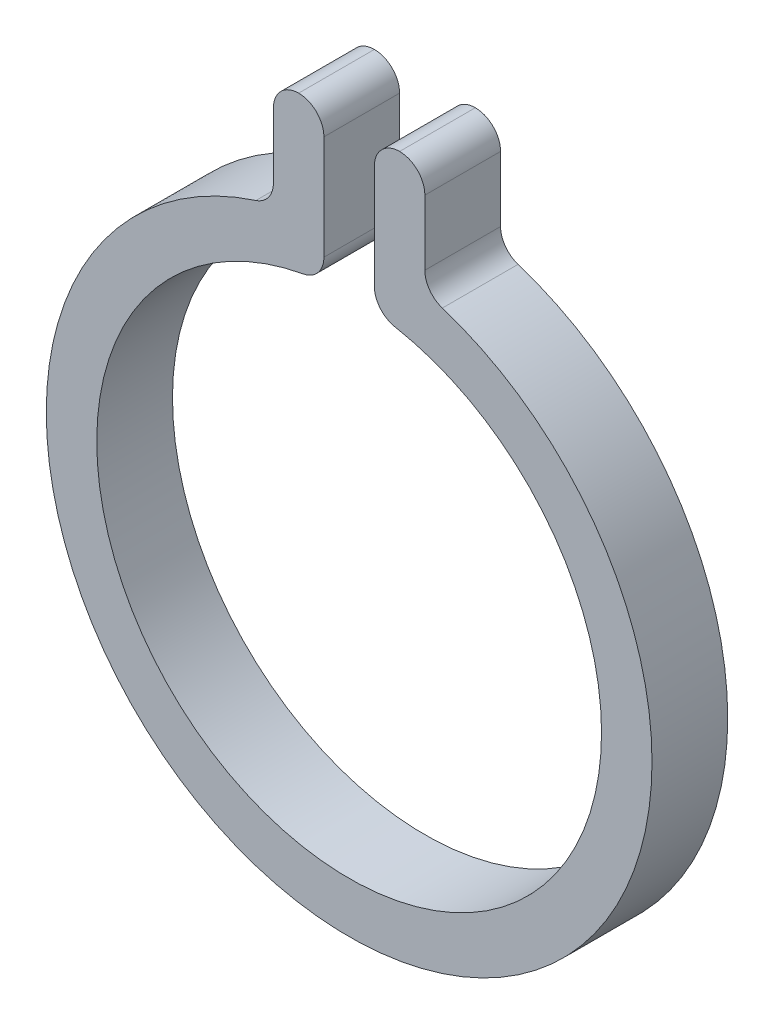
ISO-10303-21;
HEADER;
FILE_DESCRIPTION(('STEP AP214'),'2;1');
FILE_NAME('part.step','',(''),(''),'','','');
FILE_SCHEMA(('AUTOMOTIVE_DESIGN { 1 0 10303 214 1 1 1 1 }'));
ENDSEC;
DATA;
#1=APPLICATION_CONTEXT('core data for automotive mechanical design processes');
#2=APPLICATION_PROTOCOL_DEFINITION('international standard','automotive_design',2000,#1);
#3=PRODUCT_CONTEXT('',#1,'mechanical');
#4=PRODUCT('Part','Part','',(#3));
#5=PRODUCT_RELATED_PRODUCT_CATEGORY('part','',(#4));
#6=PRODUCT_DEFINITION_FORMATION('','',#4);
#7=PRODUCT_DEFINITION_CONTEXT('part definition',#1,'design');
#8=PRODUCT_DEFINITION('design','',#6,#7);
#9=PRODUCT_DEFINITION_SHAPE('','',#8);
#10=(LENGTH_UNIT() NAMED_UNIT(*) SI_UNIT(.MILLI.,.METRE.));
#11=(NAMED_UNIT(*) PLANE_ANGLE_UNIT() SI_UNIT($,.RADIAN.));
#12=(NAMED_UNIT(*) SI_UNIT($,.STERADIAN.) SOLID_ANGLE_UNIT());
#13=UNCERTAINTY_MEASURE_WITH_UNIT(LENGTH_MEASURE(1.E-05),#10,'distance_accuracy_value','');
#14=(GEOMETRIC_REPRESENTATION_CONTEXT(3) GLOBAL_UNCERTAINTY_ASSIGNED_CONTEXT((#13)) GLOBAL_UNIT_ASSIGNED_CONTEXT((#10,
#11,#12)) REPRESENTATION_CONTEXT('',''));
#15=CARTESIAN_POINT('',(0.,0.,0.));
#16=DIRECTION('',(0.,0.,1.));
#17=DIRECTION('',(1.,0.,0.));
#18=AXIS2_PLACEMENT_3D('',#15,#16,#17);
#19=CARTESIAN_POINT('',(-6.,0.,6.));
#20=DIRECTION('',(-1.,0.,0.));
#21=DIRECTION('',(0.,-1.,0.));
#22=AXIS2_PLACEMENT_3D('',#19,#20,#21);
#23=PLANE('',#22);
#24=DIRECTION('',(0.,1.,0.));
#25=VECTOR('',#24,1.);
#26=CARTESIAN_POINT('',(-6.,0.,6.));
#27=LINE('',#26,#25);
#28=CARTESIAN_POINT('',(-6.,24.738633753706,6.));
#29=VERTEX_POINT('',#28);
#30=CARTESIAN_POINT('',(-6.,29.8918735928238,6.));
#31=VERTEX_POINT('',#30);
#32=EDGE_CURVE('E212',#29,#31,#27,.T.);
#33=ORIENTED_EDGE('',*,*,#32,.T.);
#34=DIRECTION('',(0.,0.,-1.));
#35=VECTOR('',#34,1.);
#36=CARTESIAN_POINT('',(-6.,29.8918735928238,6.));
#37=LINE('',#36,#35);
#38=CARTESIAN_POINT('',(-6.,29.8918735928238,0.));
#39=VERTEX_POINT('',#38);
#40=EDGE_CURVE('E158',#31,#39,#37,.T.);
#41=ORIENTED_EDGE('',*,*,#40,.T.);
#42=DIRECTION('',(0.,1.,0.));
#43=VECTOR('',#42,1.);
#44=CARTESIAN_POINT('',(-6.,0.,0.));
#45=LINE('',#44,#43);
#46=CARTESIAN_POINT('',(-6.,24.738633753706,0.));
#47=VERTEX_POINT('',#46);
#48=EDGE_CURVE('E143',#47,#39,#45,.T.);
#49=ORIENTED_EDGE('',*,*,#48,.F.);
#50=DIRECTION('',(0.,0.,-1.));
#51=VECTOR('',#50,1.);
#52=CARTESIAN_POINT('',(-6.,24.738633753706,6.));
#53=LINE('',#52,#51);
#54=EDGE_CURVE('E155',#47,#29,#53,.F.);
#55=ORIENTED_EDGE('',*,*,#54,.T.);
#56=EDGE_LOOP('',(#33,#41,#49,#55));
#57=FACE_BOUND('',#56,.T.);
#58=ADVANCED_FACE('F38',(#57),#23,.T.);
#59=CARTESIAN_POINT('',(0.,0.,6.));
#60=DIRECTION('',(0.,0.,-1.));
#61=DIRECTION('',(-1.,0.,0.));
#62=AXIS2_PLACEMENT_3D('',#59,#60,#61);
#63=CYLINDRICAL_SURFACE('',#62,24.);
#64=CARTESIAN_POINT('',(0.,0.,0.));
#65=DIRECTION('',(0.,0.,1.));
#66=DIRECTION('',(1.,0.,0.));
#67=AXIS2_PLACEMENT_3D('',#64,#65,#66);
#68=CIRCLE('',#67,24.);
#69=CARTESIAN_POINT('',(-7.38461538461539,22.8356619264978,0.));
#70=VERTEX_POINT('',#69);
#71=CARTESIAN_POINT('',(7.38461538461538,22.8356619264978,0.));
#72=VERTEX_POINT('',#71);
#73=EDGE_CURVE('E146',#70,#72,#68,.T.);
#74=ORIENTED_EDGE('',*,*,#73,.T.);
#75=DIRECTION('',(0.,0.,-1.));
#76=VECTOR('',#75,1.);
#77=CARTESIAN_POINT('',(7.38461538461538,22.8356619264978,6.));
#78=LINE('',#77,#76);
#79=CARTESIAN_POINT('',(7.38461538461538,22.8356619264978,6.));
#80=VERTEX_POINT('',#79);
#81=EDGE_CURVE('E176',#72,#80,#78,.F.);
#82=ORIENTED_EDGE('',*,*,#81,.T.);
#83=CARTESIAN_POINT('',(0.,0.,6.));
#84=DIRECTION('',(0.,0.,1.));
#85=DIRECTION('',(1.,0.,0.));
#86=AXIS2_PLACEMENT_3D('',#83,#84,#85);
#87=CIRCLE('',#86,24.);
#88=CARTESIAN_POINT('',(-7.38461538461539,22.8356619264978,6.));
#89=VERTEX_POINT('',#88);
#90=EDGE_CURVE('E214',#89,#80,#87,.T.);
#91=ORIENTED_EDGE('',*,*,#90,.F.);
#92=DIRECTION('',(0.,0.,-1.));
#93=VECTOR('',#92,1.);
#94=CARTESIAN_POINT('',(-7.38461538461539,22.8356619264978,6.));
#95=LINE('',#94,#93);
#96=EDGE_CURVE('E174',#89,#70,#95,.T.);
#97=ORIENTED_EDGE('',*,*,#96,.T.);
#98=EDGE_LOOP('',(#74,#82,#91,#97));
#99=FACE_BOUND('',#98,.T.);
#100=ADVANCED_FACE('F311',(#99),#63,.T.);
#101=CARTESIAN_POINT('',(6.,0.,6.));
#102=DIRECTION('',(-1.,0.,0.));
#103=DIRECTION('',(0.,0.,1.));
#104=AXIS2_PLACEMENT_3D('',#101,#102,#103);
#105=PLANE('',#104);
#106=DIRECTION('',(0.,1.,0.));
#107=VECTOR('',#106,1.);
#108=CARTESIAN_POINT('',(6.,0.,0.));
#109=LINE('',#108,#107);
#110=CARTESIAN_POINT('',(6.,24.738633753706,0.));
#111=VERTEX_POINT('',#110);
#112=CARTESIAN_POINT('',(6.,29.8918735928238,0.));
#113=VERTEX_POINT('',#112);
#114=EDGE_CURVE('E288',#111,#113,#109,.T.);
#115=ORIENTED_EDGE('',*,*,#114,.T.);
#116=DIRECTION('',(0.,0.,-1.));
#117=VECTOR('',#116,1.);
#118=CARTESIAN_POINT('',(6.,29.8918735928238,6.));
#119=LINE('',#118,#117);
#120=CARTESIAN_POINT('',(6.,29.8918735928238,6.));
#121=VERTEX_POINT('',#120);
#122=EDGE_CURVE('E272',#113,#121,#119,.F.);
#123=ORIENTED_EDGE('',*,*,#122,.T.);
#124=DIRECTION('',(0.,1.,0.));
#125=VECTOR('',#124,1.);
#126=CARTESIAN_POINT('',(6.,0.,6.));
#127=LINE('',#126,#125);
#128=CARTESIAN_POINT('',(6.,24.738633753706,6.));
#129=VERTEX_POINT('',#128);
#130=EDGE_CURVE('E220',#129,#121,#127,.T.);
#131=ORIENTED_EDGE('',*,*,#130,.F.);
#132=DIRECTION('',(0.,0.,1.));
#133=VECTOR('',#132,1.);
#134=CARTESIAN_POINT('',(6.,24.738633753706,0.));
#135=LINE('',#134,#133);
#136=EDGE_CURVE('E269',#129,#111,#135,.F.);
#137=ORIENTED_EDGE('',*,*,#136,.T.);
#138=EDGE_LOOP('',(#115,#123,#131,#137));
#139=FACE_BOUND('',#138,.T.);
#140=ADVANCED_FACE('F303',(#139),#105,.F.);
#141=CARTESIAN_POINT('',(2.,0.,6.));
#142=DIRECTION('',(-1.,0.,0.));
#143=DIRECTION('',(0.,0.,1.));
#144=AXIS2_PLACEMENT_3D('',#141,#142,#143);
#145=PLANE('',#144);
#146=DIRECTION('',(0.,1.,0.));
#147=VECTOR('',#146,1.);
#148=CARTESIAN_POINT('',(2.,0.,6.));
#149=LINE('',#148,#147);
#150=CARTESIAN_POINT('',(2.,21.6333076527839,6.));
#151=VERTEX_POINT('',#150);
#152=CARTESIAN_POINT('',(2.,29.8918735928238,6.));
#153=VERTEX_POINT('',#152);
#154=EDGE_CURVE('E225',#151,#153,#149,.T.);
#155=ORIENTED_EDGE('',*,*,#154,.T.);
#156=DIRECTION('',(0.,0.,-1.));
#157=VECTOR('',#156,1.);
#158=CARTESIAN_POINT('',(2.,29.8918735928238,6.));
#159=LINE('',#158,#157);
#160=CARTESIAN_POINT('',(2.,29.8918735928238,0.));
#161=VERTEX_POINT('',#160);
#162=EDGE_CURVE('E240',#153,#161,#159,.T.);
#163=ORIENTED_EDGE('',*,*,#162,.T.);
#164=DIRECTION('',(0.,1.,0.));
#165=VECTOR('',#164,1.);
#166=CARTESIAN_POINT('',(2.,0.,0.));
#167=LINE('',#166,#165);
#168=CARTESIAN_POINT('',(2.,21.6333076527839,0.));
#169=VERTEX_POINT('',#168);
#170=EDGE_CURVE('E256',#169,#161,#167,.T.);
#171=ORIENTED_EDGE('',*,*,#170,.F.);
#172=DIRECTION('',(0.,0.,-1.));
#173=VECTOR('',#172,1.);
#174=CARTESIAN_POINT('',(2.,21.6333076527839,6.));
#175=LINE('',#174,#173);
#176=EDGE_CURVE('E237',#169,#151,#175,.F.);
#177=ORIENTED_EDGE('',*,*,#176,.T.);
#178=EDGE_LOOP('',(#155,#163,#171,#177));
#179=FACE_BOUND('',#178,.T.);
#180=ADVANCED_FACE('F318',(#179),#145,.T.);
#181=CARTESIAN_POINT('',(0.,0.,6.));
#182=DIRECTION('',(0.,0.,-1.));
#183=DIRECTION('',(-1.,0.,0.));
#184=AXIS2_PLACEMENT_3D('',#181,#182,#183);
#185=CYLINDRICAL_SURFACE('',#184,20.);
#186=CARTESIAN_POINT('',(0.,0.,0.));
#187=DIRECTION('',(0.,0.,1.));
#188=DIRECTION('',(1.,0.,0.));
#189=AXIS2_PLACEMENT_3D('',#186,#187,#188);
#190=CIRCLE('',#189,20.);
#191=CARTESIAN_POINT('',(-3.63636363636364,19.6666433207127,0.));
#192=VERTEX_POINT('',#191);
#193=CARTESIAN_POINT('',(3.63636363636364,19.6666433207127,0.));
#194=VERTEX_POINT('',#193);
#195=EDGE_CURVE('E254',#192,#194,#190,.T.);
#196=ORIENTED_EDGE('',*,*,#195,.F.);
#197=DIRECTION('',(0.,0.,-1.));
#198=VECTOR('',#197,1.);
#199=CARTESIAN_POINT('',(-3.63636363636364,19.6666433207127,6.));
#200=LINE('',#199,#198);
#201=CARTESIAN_POINT('',(-3.63636363636364,19.6666433207127,6.));
#202=VERTEX_POINT('',#201);
#203=EDGE_CURVE('E172',#192,#202,#200,.F.);
#204=ORIENTED_EDGE('',*,*,#203,.T.);
#205=CARTESIAN_POINT('',(0.,0.,6.));
#206=DIRECTION('',(0.,0.,1.));
#207=DIRECTION('',(1.,0.,0.));
#208=AXIS2_PLACEMENT_3D('',#205,#206,#207);
#209=CIRCLE('',#208,20.);
#210=CARTESIAN_POINT('',(3.63636363636364,19.6666433207127,6.));
#211=VERTEX_POINT('',#210);
#212=EDGE_CURVE('E279',#202,#211,#209,.T.);
#213=ORIENTED_EDGE('',*,*,#212,.T.);
#214=DIRECTION('',(0.,0.,-1.));
#215=VECTOR('',#214,1.);
#216=CARTESIAN_POINT('',(3.63636363636364,19.6666433207127,6.));
#217=LINE('',#216,#215);
#218=EDGE_CURVE('E164',#211,#194,#217,.T.);
#219=ORIENTED_EDGE('',*,*,#218,.T.);
#220=EDGE_LOOP('',(#196,#204,#213,#219));
#221=FACE_BOUND('',#220,.T.);
#222=ADVANCED_FACE('F325',(#221),#185,.F.);
#223=CARTESIAN_POINT('',(-2.,0.,6.));
#224=DIRECTION('',(-1.,0.,0.));
#225=DIRECTION('',(0.,0.,1.));
#226=AXIS2_PLACEMENT_3D('',#223,#224,#225);
#227=PLANE('',#226);
#228=DIRECTION('',(0.,1.,0.));
#229=VECTOR('',#228,1.);
#230=CARTESIAN_POINT('',(-2.,0.,0.));
#231=LINE('',#230,#229);
#232=CARTESIAN_POINT('',(-2.,21.6333076527839,0.));
#233=VERTEX_POINT('',#232);
#234=CARTESIAN_POINT('',(-2.,29.8918735928238,0.));
#235=VERTEX_POINT('',#234);
#236=EDGE_CURVE('E215',#233,#235,#231,.T.);
#237=ORIENTED_EDGE('',*,*,#236,.T.);
#238=DIRECTION('',(0.,0.,-1.));
#239=VECTOR('',#238,1.);
#240=CARTESIAN_POINT('',(-2.,29.8918735928238,6.));
#241=LINE('',#240,#239);
#242=CARTESIAN_POINT('',(-2.,29.8918735928238,6.));
#243=VERTEX_POINT('',#242);
#244=EDGE_CURVE('E162',#235,#243,#241,.F.);
#245=ORIENTED_EDGE('',*,*,#244,.T.);
#246=DIRECTION('',(0.,1.,0.));
#247=VECTOR('',#246,1.);
#248=CARTESIAN_POINT('',(-2.,0.,6.));
#249=LINE('',#248,#247);
#250=CARTESIAN_POINT('',(-2.,21.6333076527839,6.));
#251=VERTEX_POINT('',#250);
#252=EDGE_CURVE('E248',#251,#243,#249,.T.);
#253=ORIENTED_EDGE('',*,*,#252,.F.);
#254=DIRECTION('',(0.,0.,1.));
#255=VECTOR('',#254,1.);
#256=CARTESIAN_POINT('',(-2.,21.6333076527839,0.));
#257=LINE('',#256,#255);
#258=EDGE_CURVE('E166',#251,#233,#257,.F.);
#259=ORIENTED_EDGE('',*,*,#258,.T.);
#260=EDGE_LOOP('',(#237,#245,#253,#259));
#261=FACE_BOUND('',#260,.T.);
#262=ADVANCED_FACE('F247',(#261),#227,.F.);
#263=CARTESIAN_POINT('',(0.,0.,6.));
#264=DIRECTION('',(0.,0.,1.));
#265=DIRECTION('',(1.,0.,0.));
#266=AXIS2_PLACEMENT_3D('',#263,#264,#265);
#267=PLANE('',#266);
#268=ORIENTED_EDGE('',*,*,#130,.T.);
#269=CARTESIAN_POINT('',(4.,29.8918735928238,6.));
#270=DIRECTION('',(0.,0.,1.));
#271=DIRECTION('',(1.,0.,0.));
#272=AXIS2_PLACEMENT_3D('',#269,#270,#271);
#273=CIRCLE('',#272,2.);
#274=CARTESIAN_POINT('',(4.,31.8918735928238,6.));
#275=VERTEX_POINT('',#274);
#276=EDGE_CURVE('E233',#121,#275,#273,.T.);
#277=ORIENTED_EDGE('',*,*,#276,.T.);
#278=CARTESIAN_POINT('',(4.,29.8918735928238,6.));
#279=DIRECTION('',(0.,0.,1.));
#280=DIRECTION('',(1.,0.,0.));
#281=AXIS2_PLACEMENT_3D('',#278,#279,#280);
#282=CIRCLE('',#281,2.);
#283=EDGE_CURVE('E198',#275,#153,#282,.T.);
#284=ORIENTED_EDGE('',*,*,#283,.T.);
#285=ORIENTED_EDGE('',*,*,#154,.F.);
#286=CARTESIAN_POINT('',(4.,21.6333076527839,6.));
#287=DIRECTION('',(0.,0.,1.));
#288=DIRECTION('',(1.,0.,0.));
#289=AXIS2_PLACEMENT_3D('',#286,#287,#288);
#290=CIRCLE('',#289,2.);
#291=EDGE_CURVE('E201',#151,#211,#290,.T.);
#292=ORIENTED_EDGE('',*,*,#291,.T.);
#293=ORIENTED_EDGE('',*,*,#212,.F.);
#294=CARTESIAN_POINT('',(-4.,21.6333076527839,6.));
#295=DIRECTION('',(0.,0.,1.));
#296=DIRECTION('',(1.,0.,0.));
#297=AXIS2_PLACEMENT_3D('',#294,#295,#296);
#298=CIRCLE('',#297,2.);
#299=EDGE_CURVE('E194',#202,#251,#298,.T.);
#300=ORIENTED_EDGE('',*,*,#299,.T.);
#301=ORIENTED_EDGE('',*,*,#252,.T.);
#302=CARTESIAN_POINT('',(-4.,29.8918735928238,6.));
#303=DIRECTION('',(0.,0.,1.));
#304=DIRECTION('',(1.,0.,0.));
#305=AXIS2_PLACEMENT_3D('',#302,#303,#304);
#306=CIRCLE('',#305,2.);
#307=CARTESIAN_POINT('',(-4.,31.8918735928238,6.));
#308=VERTEX_POINT('',#307);
#309=EDGE_CURVE('E56',#243,#308,#306,.T.);
#310=ORIENTED_EDGE('',*,*,#309,.T.);
#311=CARTESIAN_POINT('',(-4.,29.8918735928238,6.));
#312=DIRECTION('',(0.,0.,1.));
#313=DIRECTION('',(1.,0.,0.));
#314=AXIS2_PLACEMENT_3D('',#311,#312,#313);
#315=CIRCLE('',#314,2.);
#316=EDGE_CURVE('E192',#308,#31,#315,.T.);
#317=ORIENTED_EDGE('',*,*,#316,.T.);
#318=ORIENTED_EDGE('',*,*,#32,.F.);
#319=CARTESIAN_POINT('',(-8.,24.738633753706,6.));
#320=DIRECTION('',(0.,0.,1.));
#321=DIRECTION('',(1.,0.,0.));
#322=AXIS2_PLACEMENT_3D('',#319,#320,#321);
#323=CIRCLE('',#322,2.);
#324=EDGE_CURVE('E12',#29,#89,#323,.F.);
#325=ORIENTED_EDGE('',*,*,#324,.T.);
#326=ORIENTED_EDGE('',*,*,#90,.T.);
#327=CARTESIAN_POINT('',(8.,24.738633753706,6.));
#328=DIRECTION('',(0.,0.,1.));
#329=DIRECTION('',(1.,0.,0.));
#330=AXIS2_PLACEMENT_3D('',#327,#328,#329);
#331=CIRCLE('',#330,2.);
#332=EDGE_CURVE('E151',#80,#129,#331,.F.);
#333=ORIENTED_EDGE('',*,*,#332,.T.);
#334=EDGE_LOOP('',(#268,#277,#284,#285,#292,#293,#300,#301,#310,#317,#318,#325,#326,#333));
#335=FACE_BOUND('',#334,.T.);
#336=ADVANCED_FACE('F313',(#335),#267,.T.);
#337=CARTESIAN_POINT('',(0.,0.,0.));
#338=DIRECTION('',(0.,0.,1.));
#339=DIRECTION('',(1.,0.,0.));
#340=AXIS2_PLACEMENT_3D('',#337,#338,#339);
#341=PLANE('',#340);
#342=CARTESIAN_POINT('',(4.,29.8918735928238,0.));
#343=DIRECTION('',(0.,0.,1.));
#344=DIRECTION('',(1.,0.,0.));
#345=AXIS2_PLACEMENT_3D('',#342,#343,#344);
#346=CIRCLE('',#345,2.);
#347=CARTESIAN_POINT('',(4.,31.8918735928238,0.));
#348=VERTEX_POINT('',#347);
#349=EDGE_CURVE('E265',#161,#348,#346,.F.);
#350=ORIENTED_EDGE('',*,*,#349,.T.);
#351=CARTESIAN_POINT('',(4.,29.8918735928238,0.));
#352=DIRECTION('',(0.,0.,1.));
#353=DIRECTION('',(1.,0.,0.));
#354=AXIS2_PLACEMENT_3D('',#351,#352,#353);
#355=CIRCLE('',#354,2.);
#356=EDGE_CURVE('E267',#348,#113,#355,.F.);
#357=ORIENTED_EDGE('',*,*,#356,.T.);
#358=ORIENTED_EDGE('',*,*,#114,.F.);
#359=CARTESIAN_POINT('',(8.,24.738633753706,0.));
#360=DIRECTION('',(0.,0.,1.));
#361=DIRECTION('',(1.,0.,0.));
#362=AXIS2_PLACEMENT_3D('',#359,#360,#361);
#363=CIRCLE('',#362,2.);
#364=EDGE_CURVE('E178',#111,#72,#363,.T.);
#365=ORIENTED_EDGE('',*,*,#364,.T.);
#366=ORIENTED_EDGE('',*,*,#73,.F.);
#367=CARTESIAN_POINT('',(-8.,24.738633753706,0.));
#368=DIRECTION('',(0.,0.,1.));
#369=DIRECTION('',(1.,0.,0.));
#370=AXIS2_PLACEMENT_3D('',#367,#368,#369);
#371=CIRCLE('',#370,2.);
#372=EDGE_CURVE('E48',#70,#47,#371,.T.);
#373=ORIENTED_EDGE('',*,*,#372,.T.);
#374=ORIENTED_EDGE('',*,*,#48,.T.);
#375=CARTESIAN_POINT('',(-4.,29.8918735928238,0.));
#376=DIRECTION('',(0.,0.,1.));
#377=DIRECTION('',(1.,0.,0.));
#378=AXIS2_PLACEMENT_3D('',#375,#376,#377);
#379=CIRCLE('',#378,2.);
#380=CARTESIAN_POINT('',(-4.,31.8918735928238,0.));
#381=VERTEX_POINT('',#380);
#382=EDGE_CURVE('E191',#39,#381,#379,.F.);
#383=ORIENTED_EDGE('',*,*,#382,.T.);
#384=CARTESIAN_POINT('',(-4.,29.8918735928238,0.));
#385=DIRECTION('',(0.,0.,1.));
#386=DIRECTION('',(1.,0.,0.));
#387=AXIS2_PLACEMENT_3D('',#384,#385,#386);
#388=CIRCLE('',#387,2.);
#389=EDGE_CURVE('E188',#381,#235,#388,.F.);
#390=ORIENTED_EDGE('',*,*,#389,.T.);
#391=ORIENTED_EDGE('',*,*,#236,.F.);
#392=CARTESIAN_POINT('',(-4.,21.6333076527839,0.));
#393=DIRECTION('',(0.,0.,1.));
#394=DIRECTION('',(1.,0.,0.));
#395=AXIS2_PLACEMENT_3D('',#392,#393,#394);
#396=CIRCLE('',#395,2.);
#397=EDGE_CURVE('E252',#233,#192,#396,.F.);
#398=ORIENTED_EDGE('',*,*,#397,.T.);
#399=ORIENTED_EDGE('',*,*,#195,.T.);
#400=CARTESIAN_POINT('',(4.,21.6333076527839,0.));
#401=DIRECTION('',(0.,0.,1.));
#402=DIRECTION('',(1.,0.,0.));
#403=AXIS2_PLACEMENT_3D('',#400,#401,#402);
#404=CIRCLE('',#403,2.);
#405=EDGE_CURVE('E260',#194,#169,#404,.F.);
#406=ORIENTED_EDGE('',*,*,#405,.T.);
#407=ORIENTED_EDGE('',*,*,#170,.T.);
#408=EDGE_LOOP('',(#350,#357,#358,#365,#366,#373,#374,#383,#390,#391,#398,#399,#406,#407));
#409=FACE_BOUND('',#408,.T.);
#410=ADVANCED_FACE('F142',(#409),#341,.F.);
#411=CARTESIAN_POINT('',(4.,29.8918735928238,6.));
#412=DIRECTION('',(0.,0.,-1.));
#413=DIRECTION('',(-1.,0.,0.));
#414=AXIS2_PLACEMENT_3D('',#411,#412,#413);
#415=CYLINDRICAL_SURFACE('',#414,2.);
#416=ORIENTED_EDGE('',*,*,#162,.F.);
#417=ORIENTED_EDGE('',*,*,#283,.F.);
#418=DIRECTION('',(0.,0.,-1.));
#419=VECTOR('',#418,1.);
#420=CARTESIAN_POINT('',(4.,31.8918735928238,6.));
#421=LINE('',#420,#419);
#422=EDGE_CURVE('E159',#348,#275,#421,.F.);
#423=ORIENTED_EDGE('',*,*,#422,.F.);
#424=ORIENTED_EDGE('',*,*,#349,.F.);
#425=EDGE_LOOP('',(#416,#417,#423,#424));
#426=FACE_BOUND('',#425,.T.);
#427=ADVANCED_FACE('F297',(#426),#415,.T.);
#428=CARTESIAN_POINT('',(4.,29.8918735928238,6.));
#429=DIRECTION('',(0.,0.,1.));
#430=DIRECTION('',(1.,0.,0.));
#431=AXIS2_PLACEMENT_3D('',#428,#429,#430);
#432=CYLINDRICAL_SURFACE('',#431,2.);
#433=ORIENTED_EDGE('',*,*,#276,.F.);
#434=ORIENTED_EDGE('',*,*,#122,.F.);
#435=ORIENTED_EDGE('',*,*,#356,.F.);
#436=ORIENTED_EDGE('',*,*,#422,.T.);
#437=EDGE_LOOP('',(#433,#434,#435,#436));
#438=FACE_BOUND('',#437,.T.);
#439=ADVANCED_FACE('F300',(#438),#432,.T.);
#440=CARTESIAN_POINT('',(-4.,29.8918735928238,6.));
#441=DIRECTION('',(0.,0.,-1.));
#442=DIRECTION('',(-1.,0.,0.));
#443=AXIS2_PLACEMENT_3D('',#440,#441,#442);
#444=CYLINDRICAL_SURFACE('',#443,2.);
#445=ORIENTED_EDGE('',*,*,#40,.F.);
#446=ORIENTED_EDGE('',*,*,#316,.F.);
#447=DIRECTION('',(0.,0.,-1.));
#448=VECTOR('',#447,1.);
#449=CARTESIAN_POINT('',(-4.,31.8918735928238,6.));
#450=LINE('',#449,#448);
#451=EDGE_CURVE('E42',#381,#308,#450,.F.);
#452=ORIENTED_EDGE('',*,*,#451,.F.);
#453=ORIENTED_EDGE('',*,*,#382,.F.);
#454=EDGE_LOOP('',(#445,#446,#452,#453));
#455=FACE_BOUND('',#454,.T.);
#456=ADVANCED_FACE('F190',(#455),#444,.T.);
#457=CARTESIAN_POINT('',(-4.,29.8918735928238,6.));
#458=DIRECTION('',(0.,0.,1.));
#459=DIRECTION('',(1.,0.,0.));
#460=AXIS2_PLACEMENT_3D('',#457,#458,#459);
#461=CYLINDRICAL_SURFACE('',#460,2.);
#462=ORIENTED_EDGE('',*,*,#309,.F.);
#463=ORIENTED_EDGE('',*,*,#244,.F.);
#464=ORIENTED_EDGE('',*,*,#389,.F.);
#465=ORIENTED_EDGE('',*,*,#451,.T.);
#466=EDGE_LOOP('',(#462,#463,#464,#465));
#467=FACE_BOUND('',#466,.T.);
#468=ADVANCED_FACE('F187',(#467),#461,.T.);
#469=CARTESIAN_POINT('',(-4.,21.6333076527839,6.));
#470=DIRECTION('',(0.,0.,-1.));
#471=DIRECTION('',(-1.,0.,0.));
#472=AXIS2_PLACEMENT_3D('',#469,#470,#471);
#473=CYLINDRICAL_SURFACE('',#472,2.);
#474=ORIENTED_EDGE('',*,*,#299,.F.);
#475=ORIENTED_EDGE('',*,*,#203,.F.);
#476=ORIENTED_EDGE('',*,*,#397,.F.);
#477=ORIENTED_EDGE('',*,*,#258,.F.);
#478=EDGE_LOOP('',(#474,#475,#476,#477));
#479=FACE_BOUND('',#478,.T.);
#480=ADVANCED_FACE('F327',(#479),#473,.T.);
#481=CARTESIAN_POINT('',(4.,21.6333076527839,6.));
#482=DIRECTION('',(0.,0.,-1.));
#483=DIRECTION('',(-1.,0.,0.));
#484=AXIS2_PLACEMENT_3D('',#481,#482,#483);
#485=CYLINDRICAL_SURFACE('',#484,2.);
#486=ORIENTED_EDGE('',*,*,#291,.F.);
#487=ORIENTED_EDGE('',*,*,#176,.F.);
#488=ORIENTED_EDGE('',*,*,#405,.F.);
#489=ORIENTED_EDGE('',*,*,#218,.F.);
#490=EDGE_LOOP('',(#486,#487,#488,#489));
#491=FACE_BOUND('',#490,.T.);
#492=ADVANCED_FACE('F321',(#491),#485,.T.);
#493=CARTESIAN_POINT('',(8.,24.738633753706,6.));
#494=DIRECTION('',(0.,0.,-1.));
#495=DIRECTION('',(-1.,0.,0.));
#496=AXIS2_PLACEMENT_3D('',#493,#494,#495);
#497=CYLINDRICAL_SURFACE('',#496,2.);
#498=ORIENTED_EDGE('',*,*,#332,.F.);
#499=ORIENTED_EDGE('',*,*,#81,.F.);
#500=ORIENTED_EDGE('',*,*,#364,.F.);
#501=ORIENTED_EDGE('',*,*,#136,.F.);
#502=EDGE_LOOP('',(#498,#499,#500,#501));
#503=FACE_BOUND('',#502,.T.);
#504=ADVANCED_FACE('F308',(#503),#497,.F.);
#505=CARTESIAN_POINT('',(-8.,24.738633753706,6.));
#506=DIRECTION('',(0.,0.,-1.));
#507=DIRECTION('',(-1.,0.,0.));
#508=AXIS2_PLACEMENT_3D('',#505,#506,#507);
#509=CYLINDRICAL_SURFACE('',#508,2.);
#510=ORIENTED_EDGE('',*,*,#324,.F.);
#511=ORIENTED_EDGE('',*,*,#54,.F.);
#512=ORIENTED_EDGE('',*,*,#372,.F.);
#513=ORIENTED_EDGE('',*,*,#96,.F.);
#514=EDGE_LOOP('',(#510,#511,#512,#513));
#515=FACE_BOUND('',#514,.T.);
#516=ADVANCED_FACE('F40',(#515),#509,.F.);
#517=CLOSED_SHELL('',(#58,#100,#140,#180,#222,#262,#336,#410,#427,#439,#456,#468,#480,#492,#504,#516));
#518=MANIFOLD_SOLID_BREP('B2',#517);
#519=ADVANCED_BREP_SHAPE_REPRESENTATION('',(#18,#518),#14);
#520=SHAPE_DEFINITION_REPRESENTATION(#9,#519);
ENDSEC;
END-ISO-10303-21;
